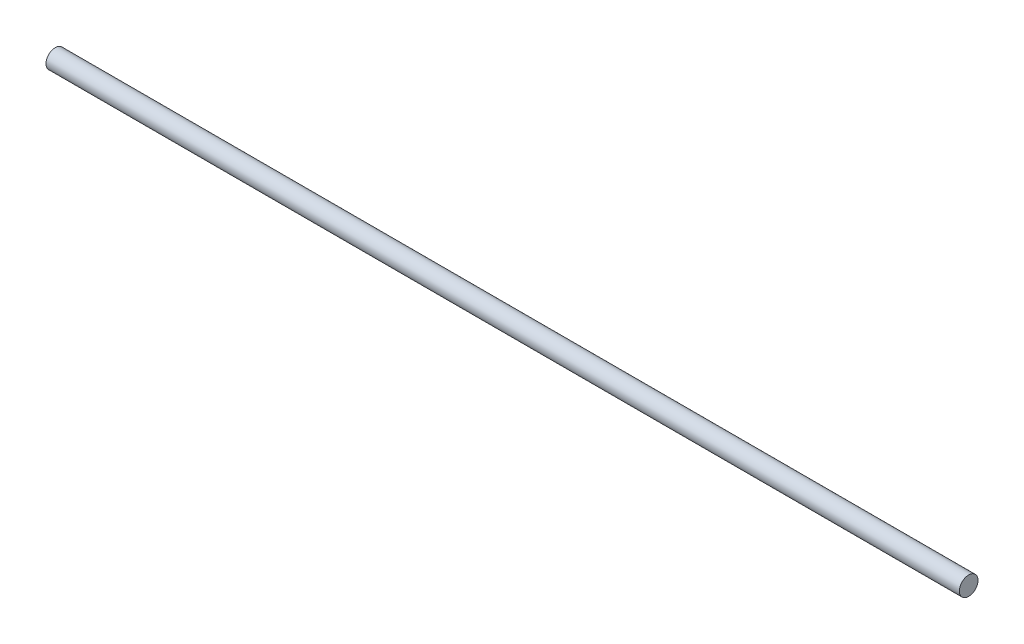
ISO-10303-21;
HEADER;
FILE_DESCRIPTION(('STEP AP214'),'2;1');
FILE_NAME('part.step','',(''),(''),'','','');
FILE_SCHEMA(('AUTOMOTIVE_DESIGN { 1 0 10303 214 1 1 1 1 }'));
ENDSEC;
DATA;
#1=APPLICATION_CONTEXT('core data for automotive mechanical design processes');
#2=APPLICATION_PROTOCOL_DEFINITION('international standard','automotive_design',2000,#1);
#3=PRODUCT_CONTEXT('',#1,'mechanical');
#4=PRODUCT('Part','Part','',(#3));
#5=PRODUCT_RELATED_PRODUCT_CATEGORY('part','',(#4));
#6=PRODUCT_DEFINITION_FORMATION('','',#4);
#7=PRODUCT_DEFINITION_CONTEXT('part definition',#1,'design');
#8=PRODUCT_DEFINITION('design','',#6,#7);
#9=PRODUCT_DEFINITION_SHAPE('','',#8);
#10=(LENGTH_UNIT() NAMED_UNIT(*) SI_UNIT(.MILLI.,.METRE.));
#11=(NAMED_UNIT(*) PLANE_ANGLE_UNIT() SI_UNIT($,.RADIAN.));
#12=(NAMED_UNIT(*) SI_UNIT($,.STERADIAN.) SOLID_ANGLE_UNIT());
#13=UNCERTAINTY_MEASURE_WITH_UNIT(LENGTH_MEASURE(1.E-05),#10,'distance_accuracy_value','');
#14=(GEOMETRIC_REPRESENTATION_CONTEXT(3) GLOBAL_UNCERTAINTY_ASSIGNED_CONTEXT((#13)) GLOBAL_UNIT_ASSIGNED_CONTEXT((#10,
#11,#12)) REPRESENTATION_CONTEXT('',''));
#15=CARTESIAN_POINT('',(0.,0.,0.));
#16=DIRECTION('',(0.,0.,1.));
#17=DIRECTION('',(1.,0.,0.));
#18=AXIS2_PLACEMENT_3D('',#15,#16,#17);
#19=CARTESIAN_POINT('',(78.5,0.,0.));
#20=DIRECTION('',(-1.,0.,0.));
#21=DIRECTION('',(0.,0.,1.));
#22=AXIS2_PLACEMENT_3D('',#19,#20,#21);
#23=CYLINDRICAL_SURFACE('',#22,0.8);
#24=CARTESIAN_POINT('',(78.5,0.,0.));
#25=DIRECTION('',(1.,0.,0.));
#26=DIRECTION('',(0.,0.,-1.));
#27=AXIS2_PLACEMENT_3D('',#24,#25,#26);
#28=CIRCLE('',#27,0.8);
#29=CARTESIAN_POINT('',(78.5,0.,-0.8));
#30=VERTEX_POINT('',#29);
#31=EDGE_CURVE('E10',#30,#30,#28,.T.);
#32=ORIENTED_EDGE('',*,*,#31,.F.);
#33=EDGE_LOOP('',(#32));
#34=FACE_BOUND('',#33,.T.);
#35=CARTESIAN_POINT('',(0.,0.,0.));
#36=DIRECTION('',(1.,0.,0.));
#37=DIRECTION('',(0.,0.,-1.));
#38=AXIS2_PLACEMENT_3D('',#35,#36,#37);
#39=CIRCLE('',#38,0.8);
#40=CARTESIAN_POINT('',(0.,0.,-0.8));
#41=VERTEX_POINT('',#40);
#42=EDGE_CURVE('E34',#41,#41,#39,.T.);
#43=ORIENTED_EDGE('',*,*,#42,.T.);
#44=EDGE_LOOP('',(#43));
#45=FACE_BOUND('',#44,.T.);
#46=ADVANCED_FACE('F31',(#34,#45),#23,.T.);
#47=CARTESIAN_POINT('',(78.5,0.,0.));
#48=DIRECTION('',(1.,0.,0.));
#49=DIRECTION('',(0.,0.,-1.));
#50=AXIS2_PLACEMENT_3D('',#47,#48,#49);
#51=PLANE('',#50);
#52=ORIENTED_EDGE('',*,*,#31,.T.);
#53=EDGE_LOOP('',(#52));
#54=FACE_BOUND('',#53,.T.);
#55=ADVANCED_FACE('F46',(#54),#51,.T.);
#56=CARTESIAN_POINT('',(0.,0.,0.));
#57=DIRECTION('',(1.,0.,0.));
#58=DIRECTION('',(0.,0.,-1.));
#59=AXIS2_PLACEMENT_3D('',#56,#57,#58);
#60=PLANE('',#59);
#61=ORIENTED_EDGE('',*,*,#42,.F.);
#62=EDGE_LOOP('',(#61));
#63=FACE_BOUND('',#62,.T.);
#64=ADVANCED_FACE('F44',(#63),#60,.F.);
#65=CLOSED_SHELL('',(#46,#55,#64));
#66=MANIFOLD_SOLID_BREP('B2',#65);
#67=ADVANCED_BREP_SHAPE_REPRESENTATION('',(#18,#66),#14);
#68=SHAPE_DEFINITION_REPRESENTATION(#9,#67);
ENDSEC;
END-ISO-10303-21;
